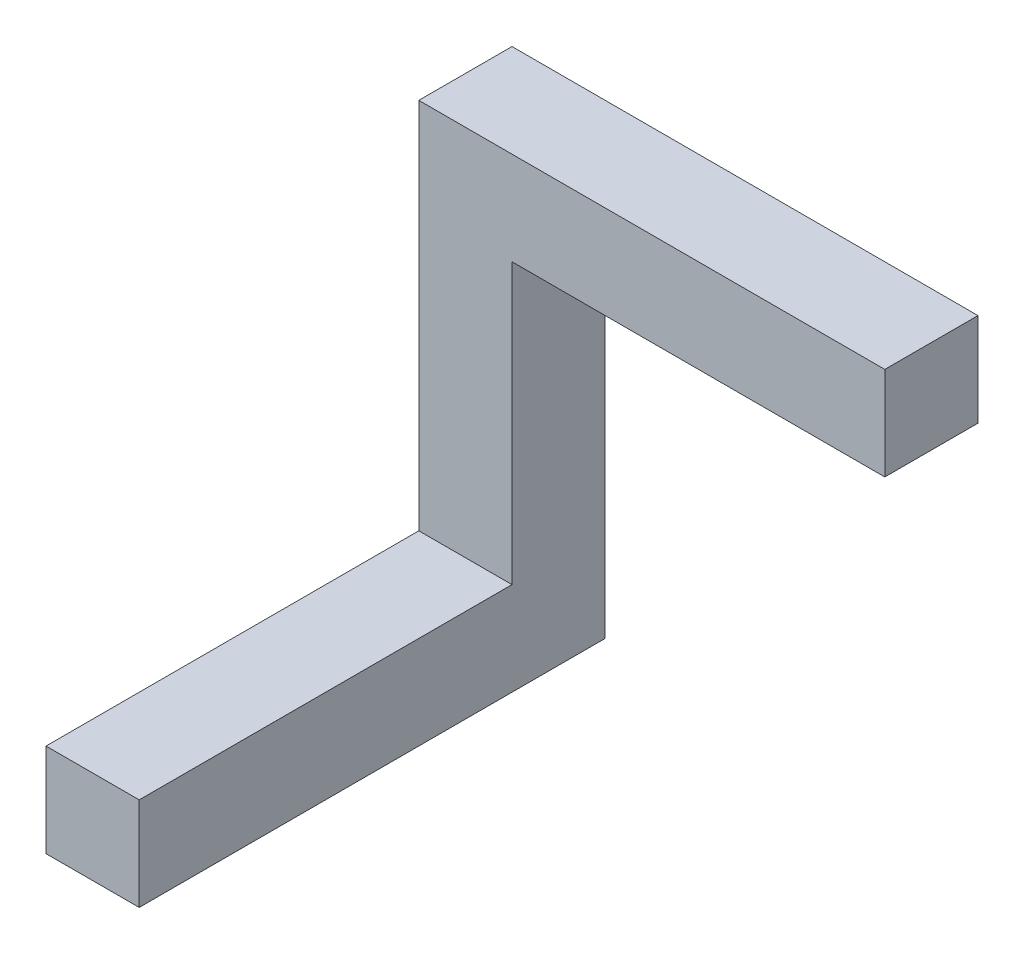
ISO-10303-21;
HEADER;
FILE_DESCRIPTION(('STEP AP214'),'2;1');
FILE_NAME('part.step','',(''),(''),'','','');
FILE_SCHEMA(('AUTOMOTIVE_DESIGN { 1 0 10303 214 1 1 1 1 }'));
ENDSEC;
DATA;
#1=APPLICATION_CONTEXT('core data for automotive mechanical design processes');
#2=APPLICATION_PROTOCOL_DEFINITION('international standard','automotive_design',2000,#1);
#3=PRODUCT_CONTEXT('',#1,'mechanical');
#4=PRODUCT('Part','Part','',(#3));
#5=PRODUCT_RELATED_PRODUCT_CATEGORY('part','',(#4));
#6=PRODUCT_DEFINITION_FORMATION('','',#4);
#7=PRODUCT_DEFINITION_CONTEXT('part definition',#1,'design');
#8=PRODUCT_DEFINITION('design','',#6,#7);
#9=PRODUCT_DEFINITION_SHAPE('','',#8);
#10=(LENGTH_UNIT() NAMED_UNIT(*) SI_UNIT(.MILLI.,.METRE.));
#11=(NAMED_UNIT(*) PLANE_ANGLE_UNIT() SI_UNIT($,.RADIAN.));
#12=(NAMED_UNIT(*) SI_UNIT($,.STERADIAN.) SOLID_ANGLE_UNIT());
#13=UNCERTAINTY_MEASURE_WITH_UNIT(LENGTH_MEASURE(1.E-05),#10,'distance_accuracy_value','');
#14=(GEOMETRIC_REPRESENTATION_CONTEXT(3) GLOBAL_UNCERTAINTY_ASSIGNED_CONTEXT((#13)) GLOBAL_UNIT_ASSIGNED_CONTEXT((#10,
#11,#12)) REPRESENTATION_CONTEXT('',''));
#15=CARTESIAN_POINT('',(0.,0.,0.));
#16=DIRECTION('',(0.,0.,1.));
#17=DIRECTION('',(1.,0.,0.));
#18=AXIS2_PLACEMENT_3D('',#15,#16,#17);
#19=CARTESIAN_POINT('',(0.,0.,30.));
#20=DIRECTION('',(0.,0.,-1.));
#21=DIRECTION('',(-1.,0.,0.));
#22=AXIS2_PLACEMENT_3D('',#19,#20,#21);
#23=PLANE('',#22);
#24=DIRECTION('',(-1.,0.,0.));
#25=VECTOR('',#24,1.);
#26=CARTESIAN_POINT('',(0.,15.,30.));
#27=LINE('',#26,#25);
#28=CARTESIAN_POINT('',(-100.,15.,30.));
#29=VERTEX_POINT('',#28);
#30=CARTESIAN_POINT('',(-130.,15.,30.));
#31=VERTEX_POINT('',#30);
#32=EDGE_CURVE('E56',#29,#31,#27,.T.);
#33=ORIENTED_EDGE('',*,*,#32,.F.);
#34=DIRECTION('',(0.,1.,0.));
#35=VECTOR('',#34,1.);
#36=CARTESIAN_POINT('',(-100.,105.,30.));
#37=LINE('',#36,#35);
#38=CARTESIAN_POINT('',(-100.,105.,30.));
#39=VERTEX_POINT('',#38);
#40=EDGE_CURVE('E147',#29,#39,#37,.T.);
#41=ORIENTED_EDGE('',*,*,#40,.T.);
#42=DIRECTION('',(1.,0.,0.));
#43=VECTOR('',#42,1.);
#44=CARTESIAN_POINT('',(-100.,105.,30.));
#45=LINE('',#44,#43);
#46=CARTESIAN_POINT('',(20.,105.,30.));
#47=VERTEX_POINT('',#46);
#48=EDGE_CURVE('E149',#39,#47,#45,.T.);
#49=ORIENTED_EDGE('',*,*,#48,.T.);
#50=DIRECTION('',(0.,1.,0.));
#51=VECTOR('',#50,1.);
#52=CARTESIAN_POINT('',(20.,135.,30.));
#53=LINE('',#52,#51);
#54=CARTESIAN_POINT('',(20.,135.,30.));
#55=VERTEX_POINT('',#54);
#56=EDGE_CURVE('E64',#47,#55,#53,.T.);
#57=ORIENTED_EDGE('',*,*,#56,.T.);
#58=DIRECTION('',(-1.,0.,0.));
#59=VECTOR('',#58,1.);
#60=CARTESIAN_POINT('',(-130.,135.,30.));
#61=LINE('',#60,#59);
#62=CARTESIAN_POINT('',(-130.,135.,30.));
#63=VERTEX_POINT('',#62);
#64=EDGE_CURVE('E144',#55,#63,#61,.T.);
#65=ORIENTED_EDGE('',*,*,#64,.T.);
#66=DIRECTION('',(0.,-1.,0.));
#67=VECTOR('',#66,1.);
#68=CARTESIAN_POINT('',(-130.,135.,30.));
#69=LINE('',#68,#67);
#70=EDGE_CURVE('E97',#63,#31,#69,.T.);
#71=ORIENTED_EDGE('',*,*,#70,.T.);
#72=EDGE_LOOP('',(#33,#41,#49,#57,#65,#71));
#73=FACE_BOUND('',#72,.T.);
#74=ADVANCED_FACE('F41',(#73),#23,.F.);
#75=CARTESIAN_POINT('',(-130.,135.,30.));
#76=DIRECTION('',(0.,-1.,0.));
#77=DIRECTION('',(0.,0.,-1.));
#78=AXIS2_PLACEMENT_3D('',#75,#76,#77);
#79=PLANE('',#78);
#80=DIRECTION('',(-1.,0.,0.));
#81=VECTOR('',#80,1.);
#82=CARTESIAN_POINT('',(-130.,135.,0.));
#83=LINE('',#82,#81);
#84=CARTESIAN_POINT('',(20.,135.,0.));
#85=VERTEX_POINT('',#84);
#86=CARTESIAN_POINT('',(-130.,135.,0.));
#87=VERTEX_POINT('',#86);
#88=EDGE_CURVE('E143',#85,#87,#83,.T.);
#89=ORIENTED_EDGE('',*,*,#88,.T.);
#90=DIRECTION('',(0.,0.,-1.));
#91=VECTOR('',#90,1.);
#92=CARTESIAN_POINT('',(-130.,135.,30.));
#93=LINE('',#92,#91);
#94=EDGE_CURVE('E11',#63,#87,#93,.T.);
#95=ORIENTED_EDGE('',*,*,#94,.F.);
#96=ORIENTED_EDGE('',*,*,#64,.F.);
#97=DIRECTION('',(0.,0.,-1.));
#98=VECTOR('',#97,1.);
#99=CARTESIAN_POINT('',(20.,135.,30.));
#100=LINE('',#99,#98);
#101=EDGE_CURVE('E152',#55,#85,#100,.T.);
#102=ORIENTED_EDGE('',*,*,#101,.T.);
#103=EDGE_LOOP('',(#89,#95,#96,#102));
#104=FACE_BOUND('',#103,.T.);
#105=ADVANCED_FACE('F43',(#104),#79,.F.);
#106=CARTESIAN_POINT('',(-130.,135.,30.));
#107=DIRECTION('',(1.,0.,0.));
#108=DIRECTION('',(0.,0.,-1.));
#109=AXIS2_PLACEMENT_3D('',#106,#107,#108);
#110=PLANE('',#109);
#111=DIRECTION('',(0.,0.,-1.));
#112=VECTOR('',#111,1.);
#113=CARTESIAN_POINT('',(-130.,-15.,30.));
#114=LINE('',#113,#112);
#115=CARTESIAN_POINT('',(-130.,-15.,150.));
#116=VERTEX_POINT('',#115);
#117=CARTESIAN_POINT('',(-130.,-15.,0.));
#118=VERTEX_POINT('',#117);
#119=EDGE_CURVE('E49',#116,#118,#114,.T.);
#120=ORIENTED_EDGE('',*,*,#119,.F.);
#121=DIRECTION('',(0.,-1.,0.));
#122=VECTOR('',#121,1.);
#123=CARTESIAN_POINT('',(-130.,-15.,150.));
#124=LINE('',#123,#122);
#125=CARTESIAN_POINT('',(-130.,15.,150.));
#126=VERTEX_POINT('',#125);
#127=EDGE_CURVE('E116',#126,#116,#124,.T.);
#128=ORIENTED_EDGE('',*,*,#127,.F.);
#129=DIRECTION('',(0.,0.,-1.));
#130=VECTOR('',#129,1.);
#131=CARTESIAN_POINT('',(-130.,15.,150.));
#132=LINE('',#131,#130);
#133=EDGE_CURVE('E137',#126,#31,#132,.T.);
#134=ORIENTED_EDGE('',*,*,#133,.T.);
#135=ORIENTED_EDGE('',*,*,#70,.F.);
#136=ORIENTED_EDGE('',*,*,#94,.T.);
#137=DIRECTION('',(0.,-1.,0.));
#138=VECTOR('',#137,1.);
#139=CARTESIAN_POINT('',(-130.,135.,0.));
#140=LINE('',#139,#138);
#141=EDGE_CURVE('E117',#87,#118,#140,.T.);
#142=ORIENTED_EDGE('',*,*,#141,.T.);
#143=EDGE_LOOP('',(#120,#128,#134,#135,#136,#142));
#144=FACE_BOUND('',#143,.T.);
#145=ADVANCED_FACE('F114',(#144),#110,.F.);
#146=CARTESIAN_POINT('',(-130.,-15.,30.));
#147=DIRECTION('',(0.,1.,0.));
#148=DIRECTION('',(0.,0.,1.));
#149=AXIS2_PLACEMENT_3D('',#146,#147,#148);
#150=PLANE('',#149);
#151=DIRECTION('',(1.,0.,0.));
#152=VECTOR('',#151,1.);
#153=CARTESIAN_POINT('',(-130.,-15.,0.));
#154=LINE('',#153,#152);
#155=CARTESIAN_POINT('',(-100.,-15.,0.));
#156=VERTEX_POINT('',#155);
#157=EDGE_CURVE('E156',#118,#156,#154,.T.);
#158=ORIENTED_EDGE('',*,*,#157,.T.);
#159=DIRECTION('',(0.,0.,-1.));
#160=VECTOR('',#159,1.);
#161=CARTESIAN_POINT('',(-100.,-15.,30.));
#162=LINE('',#161,#160);
#163=CARTESIAN_POINT('',(-100.,-15.,150.));
#164=VERTEX_POINT('',#163);
#165=EDGE_CURVE('E120',#164,#156,#162,.T.);
#166=ORIENTED_EDGE('',*,*,#165,.F.);
#167=DIRECTION('',(1.,0.,0.));
#168=VECTOR('',#167,1.);
#169=CARTESIAN_POINT('',(-130.,-15.,150.));
#170=LINE('',#169,#168);
#171=EDGE_CURVE('E122',#116,#164,#170,.T.);
#172=ORIENTED_EDGE('',*,*,#171,.F.);
#173=ORIENTED_EDGE('',*,*,#119,.T.);
#174=EDGE_LOOP('',(#158,#166,#172,#173));
#175=FACE_BOUND('',#174,.T.);
#176=ADVANCED_FACE('F123',(#175),#150,.F.);
#177=CARTESIAN_POINT('',(-100.,105.,30.));
#178=DIRECTION('',(-1.,0.,0.));
#179=DIRECTION('',(0.,0.,1.));
#180=AXIS2_PLACEMENT_3D('',#177,#178,#179);
#181=PLANE('',#180);
#182=DIRECTION('',(0.,1.,0.));
#183=VECTOR('',#182,1.);
#184=CARTESIAN_POINT('',(-100.,105.,0.));
#185=LINE('',#184,#183);
#186=CARTESIAN_POINT('',(-100.,105.,0.));
#187=VERTEX_POINT('',#186);
#188=EDGE_CURVE('E158',#156,#187,#185,.T.);
#189=ORIENTED_EDGE('',*,*,#188,.T.);
#190=DIRECTION('',(0.,0.,-1.));
#191=VECTOR('',#190,1.);
#192=CARTESIAN_POINT('',(-100.,105.,30.));
#193=LINE('',#192,#191);
#194=EDGE_CURVE('E166',#39,#187,#193,.T.);
#195=ORIENTED_EDGE('',*,*,#194,.F.);
#196=ORIENTED_EDGE('',*,*,#40,.F.);
#197=DIRECTION('',(0.,0.,-1.));
#198=VECTOR('',#197,1.);
#199=CARTESIAN_POINT('',(-100.,15.,150.));
#200=LINE('',#199,#198);
#201=CARTESIAN_POINT('',(-100.,15.,150.));
#202=VERTEX_POINT('',#201);
#203=EDGE_CURVE('E139',#202,#29,#200,.T.);
#204=ORIENTED_EDGE('',*,*,#203,.F.);
#205=DIRECTION('',(0.,1.,0.));
#206=VECTOR('',#205,1.);
#207=CARTESIAN_POINT('',(-100.,-15.,150.));
#208=LINE('',#207,#206);
#209=EDGE_CURVE('E127',#164,#202,#208,.T.);
#210=ORIENTED_EDGE('',*,*,#209,.F.);
#211=ORIENTED_EDGE('',*,*,#165,.T.);
#212=EDGE_LOOP('',(#189,#195,#196,#204,#210,#211));
#213=FACE_BOUND('',#212,.T.);
#214=ADVANCED_FACE('F171',(#213),#181,.F.);
#215=CARTESIAN_POINT('',(-100.,105.,30.));
#216=DIRECTION('',(0.,1.,0.));
#217=DIRECTION('',(-1.,0.,0.));
#218=AXIS2_PLACEMENT_3D('',#215,#216,#217);
#219=PLANE('',#218);
#220=DIRECTION('',(1.,0.,0.));
#221=VECTOR('',#220,1.);
#222=CARTESIAN_POINT('',(-100.,105.,0.));
#223=LINE('',#222,#221);
#224=CARTESIAN_POINT('',(20.,105.,0.));
#225=VERTEX_POINT('',#224);
#226=EDGE_CURVE('E160',#187,#225,#223,.T.);
#227=ORIENTED_EDGE('',*,*,#226,.T.);
#228=DIRECTION('',(0.,0.,-1.));
#229=VECTOR('',#228,1.);
#230=CARTESIAN_POINT('',(20.,105.,30.));
#231=LINE('',#230,#229);
#232=EDGE_CURVE('E164',#47,#225,#231,.T.);
#233=ORIENTED_EDGE('',*,*,#232,.F.);
#234=ORIENTED_EDGE('',*,*,#48,.F.);
#235=ORIENTED_EDGE('',*,*,#194,.T.);
#236=EDGE_LOOP('',(#227,#233,#234,#235));
#237=FACE_BOUND('',#236,.T.);
#238=ADVANCED_FACE('F180',(#237),#219,.F.);
#239=CARTESIAN_POINT('',(20.,135.,30.));
#240=DIRECTION('',(-1.,0.,0.));
#241=DIRECTION('',(0.,-1.,0.));
#242=AXIS2_PLACEMENT_3D('',#239,#240,#241);
#243=PLANE('',#242);
#244=DIRECTION('',(0.,1.,0.));
#245=VECTOR('',#244,1.);
#246=CARTESIAN_POINT('',(20.,135.,0.));
#247=LINE('',#246,#245);
#248=EDGE_CURVE('E91',#225,#85,#247,.T.);
#249=ORIENTED_EDGE('',*,*,#248,.T.);
#250=ORIENTED_EDGE('',*,*,#101,.F.);
#251=ORIENTED_EDGE('',*,*,#56,.F.);
#252=ORIENTED_EDGE('',*,*,#232,.T.);
#253=EDGE_LOOP('',(#249,#250,#251,#252));
#254=FACE_BOUND('',#253,.T.);
#255=ADVANCED_FACE('F182',(#254),#243,.F.);
#256=CARTESIAN_POINT('',(0.,0.,0.));
#257=DIRECTION('',(0.,0.,-1.));
#258=DIRECTION('',(-1.,0.,0.));
#259=AXIS2_PLACEMENT_3D('',#256,#257,#258);
#260=PLANE('',#259);
#261=ORIENTED_EDGE('',*,*,#157,.F.);
#262=ORIENTED_EDGE('',*,*,#141,.F.);
#263=ORIENTED_EDGE('',*,*,#88,.F.);
#264=ORIENTED_EDGE('',*,*,#248,.F.);
#265=ORIENTED_EDGE('',*,*,#226,.F.);
#266=ORIENTED_EDGE('',*,*,#188,.F.);
#267=EDGE_LOOP('',(#261,#262,#263,#264,#265,#266));
#268=FACE_BOUND('',#267,.T.);
#269=ADVANCED_FACE('F176',(#268),#260,.T.);
#270=CARTESIAN_POINT('',(-130.,15.,150.));
#271=DIRECTION('',(0.,-1.,0.));
#272=DIRECTION('',(0.,0.,-1.));
#273=AXIS2_PLACEMENT_3D('',#270,#271,#272);
#274=PLANE('',#273);
#275=ORIENTED_EDGE('',*,*,#203,.T.);
#276=ORIENTED_EDGE('',*,*,#32,.T.);
#277=ORIENTED_EDGE('',*,*,#133,.F.);
#278=DIRECTION('',(-1.,0.,0.));
#279=VECTOR('',#278,1.);
#280=CARTESIAN_POINT('',(-130.,15.,150.));
#281=LINE('',#280,#279);
#282=EDGE_CURVE('E131',#202,#126,#281,.T.);
#283=ORIENTED_EDGE('',*,*,#282,.F.);
#284=EDGE_LOOP('',(#275,#276,#277,#283));
#285=FACE_BOUND('',#284,.T.);
#286=ADVANCED_FACE('F187',(#285),#274,.F.);
#287=CARTESIAN_POINT('',(0.,0.,150.));
#288=DIRECTION('',(0.,0.,-1.));
#289=DIRECTION('',(-1.,0.,0.));
#290=AXIS2_PLACEMENT_3D('',#287,#288,#289);
#291=PLANE('',#290);
#292=ORIENTED_EDGE('',*,*,#127,.T.);
#293=ORIENTED_EDGE('',*,*,#171,.T.);
#294=ORIENTED_EDGE('',*,*,#209,.T.);
#295=ORIENTED_EDGE('',*,*,#282,.T.);
#296=EDGE_LOOP('',(#292,#293,#294,#295));
#297=FACE_BOUND('',#296,.T.);
#298=ADVANCED_FACE('F129',(#297),#291,.F.);
#299=CLOSED_SHELL('',(#74,#105,#145,#176,#214,#238,#255,#269,#286,#298));
#300=MANIFOLD_SOLID_BREP('B2',#299);
#301=ADVANCED_BREP_SHAPE_REPRESENTATION('',(#18,#300),#14);
#302=SHAPE_DEFINITION_REPRESENTATION(#9,#301);
ENDSEC;
END-ISO-10303-21;
